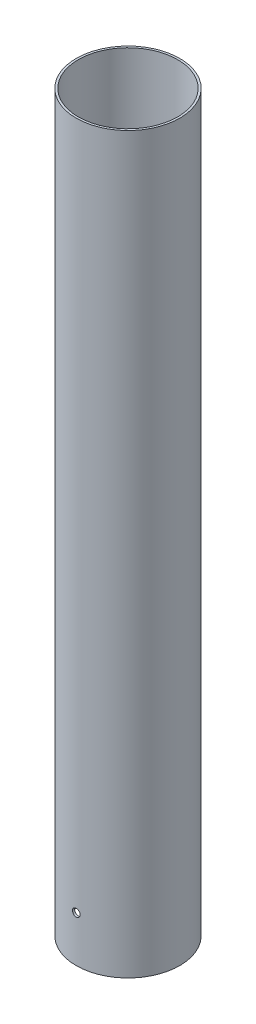
ISO-10303-21;
HEADER;
FILE_DESCRIPTION(('STEP AP214'),'2;1');
FILE_NAME('part.step','',(''),(''),'','','');
FILE_SCHEMA(('AUTOMOTIVE_DESIGN { 1 0 10303 214 1 1 1 1 }'));
ENDSEC;
DATA;
#1=APPLICATION_CONTEXT('core data for automotive mechanical design processes');
#2=APPLICATION_PROTOCOL_DEFINITION('international standard','automotive_design',2000,#1);
#3=PRODUCT_CONTEXT('',#1,'mechanical');
#4=PRODUCT('Part','Part','',(#3));
#5=PRODUCT_RELATED_PRODUCT_CATEGORY('part','',(#4));
#6=PRODUCT_DEFINITION_FORMATION('','',#4);
#7=PRODUCT_DEFINITION_CONTEXT('part definition',#1,'design');
#8=PRODUCT_DEFINITION('design','',#6,#7);
#9=PRODUCT_DEFINITION_SHAPE('','',#8);
#10=(LENGTH_UNIT() NAMED_UNIT(*) SI_UNIT(.MILLI.,.METRE.));
#11=(NAMED_UNIT(*) PLANE_ANGLE_UNIT() SI_UNIT($,.RADIAN.));
#12=(NAMED_UNIT(*) SI_UNIT($,.STERADIAN.) SOLID_ANGLE_UNIT());
#13=UNCERTAINTY_MEASURE_WITH_UNIT(LENGTH_MEASURE(1.E-05),#10,'distance_accuracy_value','');
#14=(GEOMETRIC_REPRESENTATION_CONTEXT(3) GLOBAL_UNCERTAINTY_ASSIGNED_CONTEXT((#13)) GLOBAL_UNIT_ASSIGNED_CONTEXT((#10,
#11,#12)) REPRESENTATION_CONTEXT('',''));
#15=CARTESIAN_POINT('',(0.,0.,0.));
#16=DIRECTION('',(0.,0.,1.));
#17=DIRECTION('',(1.,0.,0.));
#18=AXIS2_PLACEMENT_3D('',#15,#16,#17);
#19=CARTESIAN_POINT('',(0.,609.6,0.));
#20=DIRECTION('',(0.,1.,0.));
#21=DIRECTION('',(0.,0.,1.));
#22=AXIS2_PLACEMENT_3D('',#19,#20,#21);
#23=PLANE('',#22);
#24=CARTESIAN_POINT('',(0.,609.6,0.));
#25=DIRECTION('',(0.,1.,0.));
#26=DIRECTION('',(0.,0.,1.));
#27=AXIS2_PLACEMENT_3D('',#24,#25,#26);
#28=CIRCLE('',#27,43.);
#29=CARTESIAN_POINT('',(0.,609.6,43.));
#30=VERTEX_POINT('',#29);
#31=EDGE_CURVE('E10',#30,#30,#28,.T.);
#32=ORIENTED_EDGE('',*,*,#31,.T.);
#33=EDGE_LOOP('',(#32));
#34=FACE_BOUND('',#33,.T.);
#35=CARTESIAN_POINT('',(0.,609.6,0.));
#36=DIRECTION('',(0.,1.,0.));
#37=DIRECTION('',(0.,0.,1.));
#38=AXIS2_PLACEMENT_3D('',#35,#36,#37);
#39=CIRCLE('',#38,41.25);
#40=CARTESIAN_POINT('',(0.,609.6,41.25));
#41=VERTEX_POINT('',#40);
#42=EDGE_CURVE('E57',#41,#41,#39,.T.);
#43=ORIENTED_EDGE('',*,*,#42,.F.);
#44=EDGE_LOOP('',(#43));
#45=FACE_BOUND('',#44,.T.);
#46=ADVANCED_FACE('F40',(#34,#45),#23,.T.);
#47=CARTESIAN_POINT('',(0.,0.,0.));
#48=DIRECTION('',(0.,1.,0.));
#49=DIRECTION('',(0.,0.,1.));
#50=AXIS2_PLACEMENT_3D('',#47,#48,#49);
#51=PLANE('',#50);
#52=CARTESIAN_POINT('',(0.,0.,0.));
#53=DIRECTION('',(0.,1.,0.));
#54=DIRECTION('',(0.,0.,1.));
#55=AXIS2_PLACEMENT_3D('',#52,#53,#54);
#56=CIRCLE('',#55,43.);
#57=CARTESIAN_POINT('',(0.,0.,43.));
#58=VERTEX_POINT('',#57);
#59=EDGE_CURVE('E51',#58,#58,#56,.T.);
#60=ORIENTED_EDGE('',*,*,#59,.F.);
#61=EDGE_LOOP('',(#60));
#62=FACE_BOUND('',#61,.T.);
#63=CARTESIAN_POINT('',(0.,0.,0.));
#64=DIRECTION('',(0.,1.,0.));
#65=DIRECTION('',(0.,0.,1.));
#66=AXIS2_PLACEMENT_3D('',#63,#64,#65);
#67=CIRCLE('',#66,41.25);
#68=CARTESIAN_POINT('',(0.,0.,41.25));
#69=VERTEX_POINT('',#68);
#70=EDGE_CURVE('E56',#69,#69,#67,.T.);
#71=ORIENTED_EDGE('',*,*,#70,.T.);
#72=EDGE_LOOP('',(#71));
#73=FACE_BOUND('',#72,.T.);
#74=ADVANCED_FACE('F92',(#62,#73),#51,.F.);
#75=CARTESIAN_POINT('',(0.,609.6,0.));
#76=DIRECTION('',(0.,-1.,0.));
#77=DIRECTION('',(0.,0.,-1.));
#78=AXIS2_PLACEMENT_3D('',#75,#76,#77);
#79=CYLINDRICAL_SURFACE('',#78,43.);
#80=CARTESIAN_POINT('',(0.,41.2750000000001,-43.));
#81=CARTESIAN_POINT('',(-0.178080890278548,41.2749921925872,-42.9999984530638));
#82=CARTESIAN_POINT('',(-0.356284712003607,41.2599672013853,-42.9988819276658));
#83=CARTESIAN_POINT('',(-0.707766691666529,41.2002480288784,-42.9945352321189));
#84=CARTESIAN_POINT('',(-0.881038955698625,41.1555197827692,-42.991302635241));
#85=CARTESIAN_POINT('',(-1.21751605739711,41.0376902820454,-42.9830892896828));
#86=CARTESIAN_POINT('',(-1.38072634589228,40.9646045487394,-42.9781094974625));
#87=CARTESIAN_POINT('',(-1.69252178571755,40.7921612300685,-42.9669610179934));
#88=CARTESIAN_POINT('',(-1.84111016378582,40.6928094589692,-42.9607925939426));
#89=CARTESIAN_POINT('',(-2.11978682336371,40.4704349590726,-42.9479455835229));
#90=CARTESIAN_POINT('',(-2.24984134322119,40.347369968883,-42.9412660993587));
#91=CARTESIAN_POINT('',(-2.48746921559661,40.0811508918236,-42.9281573801845));
#92=CARTESIAN_POINT('',(-2.59504160463728,39.9379959444329,-42.921728155909));
#93=CARTESIAN_POINT('',(-2.78476194235004,39.6354613081123,-42.9098377967544));
#94=CARTESIAN_POINT('',(-2.8668808550695,39.4760633633464,-42.9043777704948));
#95=CARTESIAN_POINT('',(-3.00317760267469,39.145695027306,-42.895053543123));
#96=CARTESIAN_POINT('',(-3.05735583593308,38.9747248010661,-42.8911893192584));
#97=CARTESIAN_POINT('',(-3.13613700733552,38.6263985013542,-42.8855012577534));
#98=CARTESIAN_POINT('',(-3.16079415273694,38.4490547500252,-42.8836736808068));
#99=CARTESIAN_POINT('',(-3.18000062732119,38.0927369368438,-42.8822538289768));
#100=CARTESIAN_POINT('',(-3.17455041136404,37.9137628996626,-42.882661520323));
#101=CARTESIAN_POINT('',(-3.13374175334891,37.5596353633793,-42.8856627608789));
#102=CARTESIAN_POINT('',(-3.09844209632379,37.3844750485702,-42.8882520137184));
#103=CARTESIAN_POINT('',(-2.99902784109208,37.0425725092247,-42.8953178607517));
#104=CARTESIAN_POINT('',(-2.93491301469597,36.875830351364,-42.8997944698916));
#105=CARTESIAN_POINT('',(-2.77962213459065,36.5553092225893,-42.9101355380846));
#106=CARTESIAN_POINT('',(-2.68841956305396,36.4015431450468,-42.9160013559726));
#107=CARTESIAN_POINT('',(-2.48156125802904,36.1114800026163,-42.9284585604249));
#108=CARTESIAN_POINT('',(-2.36590513740745,35.9751832143461,-42.9350499584753));
#109=CARTESIAN_POINT('',(-2.11309240219314,35.7235857074679,-42.9482346838127));
#110=CARTESIAN_POINT('',(-1.97588494094166,35.6083360731802,-42.9548279778887));
#111=CARTESIAN_POINT('',(-1.68404214917182,35.4024988981226,-42.967258435967));
#112=CARTESIAN_POINT('',(-1.52940681002299,35.3119113695657,-42.9730955995949));
#113=CARTESIAN_POINT('',(-1.20706567203664,35.1579735918848,-42.9833568536701));
#114=CARTESIAN_POINT('',(-1.03935886587525,35.0946254443601,-42.9877808350794));
#115=CARTESIAN_POINT('',(-0.695649920978167,34.996999607294,-42.9947158983493));
#116=CARTESIAN_POINT('',(-0.519647917444296,34.9627214441193,-42.9972270113759));
#117=CARTESIAN_POINT('',(-0.164787627375498,34.9242722863006,-43.0000493884756));
#118=CARTESIAN_POINT('',(0.0140629710339285,34.9200306974933,-43.0003658106363));
#119=CARTESIAN_POINT('',(0.369932900386155,34.9415903953461,-42.9987769012005));
#120=CARTESIAN_POINT('',(0.546952244683178,34.9673914627673,-42.9968715858173));
#121=CARTESIAN_POINT('',(0.893934641233323,35.0482455935355,-42.9910568982364));
#122=CARTESIAN_POINT('',(1.06390532075827,35.1032660986625,-42.9871497567754));
#123=CARTESIAN_POINT('',(1.39220139663189,35.2409641148094,-42.9777706456797));
#124=CARTESIAN_POINT('',(1.55052664747236,35.3236419713329,-42.9722986564965));
#125=CARTESIAN_POINT('',(1.85135985062513,35.5144863066876,-42.9603910980876));
#126=CARTESIAN_POINT('',(1.99383794447536,35.6226997403129,-42.9539537618273));
#127=CARTESIAN_POINT('',(2.25863140718485,35.8614753675593,-42.94084529163));
#128=CARTESIAN_POINT('',(2.38094650065111,35.9920378663818,-42.9341741545012));
#129=CARTESIAN_POINT('',(2.60218256378532,36.272110911325,-42.9213348412408));
#130=CARTESIAN_POINT('',(2.70105759791058,36.4216577952667,-42.9151676679684));
#131=CARTESIAN_POINT('',(2.87229225765255,36.7352728023854,-42.9040479624708));
#132=CARTESIAN_POINT('',(2.9446520987531,36.8993408075386,-42.8990954203748));
#133=CARTESIAN_POINT('',(3.06072345168152,37.2371756013399,-42.8909708137378));
#134=CARTESIAN_POINT('',(3.10446347116665,37.410932551166,-42.8877969779153));
#135=CARTESIAN_POINT('',(3.16214652183753,37.7633485811067,-42.8835828597082));
#136=CARTESIAN_POINT('',(3.17608998889143,37.9420075894744,-42.8825425461141));
#137=CARTESIAN_POINT('',(3.17377954494961,38.2986996888996,-42.882713571444));
#138=CARTESIAN_POINT('',(3.15759782543107,38.4767332546271,-42.8839195274499));
#139=CARTESIAN_POINT('',(3.09564646427974,38.8275474403053,-42.8884357853101));
#140=CARTESIAN_POINT('',(3.04987677293552,39.0003280514299,-42.8917460906998));
#141=CARTESIAN_POINT('',(2.93006607131261,39.3357392648089,-42.9000966659458));
#142=CARTESIAN_POINT('',(2.85602590759719,39.4983701708278,-42.9051368839991));
#143=CARTESIAN_POINT('',(2.68178473491599,39.8089040828658,-42.9163793770205));
#144=CARTESIAN_POINT('',(2.58158426719612,39.9568073935053,-42.9225816279458));
#145=CARTESIAN_POINT('',(2.35759673077369,40.2340560767916,-42.9354668647466));
#146=CARTESIAN_POINT('',(2.2337566326123,40.3633585572988,-42.9421509100131));
#147=CARTESIAN_POINT('',(1.96609275166562,40.599389089693,-42.9552370894557));
#148=CARTESIAN_POINT('',(1.82226411498378,40.7061116424801,-42.9616391546587));
#149=CARTESIAN_POINT('',(1.51848506175089,40.8940638227667,-42.9734491093586));
#150=CARTESIAN_POINT('',(1.35850998407754,40.9752536503236,-42.9788554413436));
#151=CARTESIAN_POINT('',(1.0272712688814,41.1095188971835,-42.9880454454713));
#152=CARTESIAN_POINT('',(0.856020988799548,41.1626269335881,-42.9918309991766));
#153=CARTESIAN_POINT('',(0.569784772696316,41.225558743622,-42.9963711463035));
#154=CARTESIAN_POINT('',(0.456644461209895,41.2440749019861,-42.9977258440067));
#155=CARTESIAN_POINT('',(0.229019715307315,41.2687980285457,-42.9995407674244));
#156=CARTESIAN_POINT('',(0.114535283589739,41.2750050214499,-43.0000009949342));
#157=CARTESIAN_POINT('',(0.,41.2750000000001,-43.));
#158=B_SPLINE_CURVE_WITH_KNOTS('',3,(#80,#81,#82,#83,#84,#85,#86,#87,#88,#89,#90,#91,#92,#93,
#94,#95,#96,#97,#98,#99,#100,#101,#102,#103,#104,#105,#106,#107,#108,#109,#110,#111,#112,#113,
#114,#115,#116,#117,#118,#119,#120,#121,#122,#123,#124,#125,#126,#127,#128,#129,#130,#131,#132,
#133,#134,#135,#136,#137,#138,#139,#140,#141,#142,#143,#144,#145,#146,#147,#148,#149,#150,#151,
#152,#153,#154,#155,#156,#157),.UNSPECIFIED.,.T.,.F.,(4,2,2,2,2,2,2,2,2,2,2,2,2,2,2,2,2,2,2,2,2,
2,2,2,2,2,2,2,2,2,2,2,2,2,2,2,2,2,4),(0.,0.533824520312558,1.06826231026517,1.60240799046159,
2.13643553071395,2.67142376089227,3.20643491342423,3.74205415057173,4.27766575075546,
4.81229233356235,5.34691083928832,5.88047892103685,6.41405122822607,6.94814761296147,
7.48225245381131,8.01763689347556,8.55302159826867,9.08844760217696,9.6238648822958,
10.1580233664902,10.6921779526418,11.2257385935851,11.7593059001708,12.2938620819973,
12.828425564366,13.3640281288709,13.8996263405407,14.4346902376134,14.9697463076425,
15.5035218287095,16.0372982465875,16.571058681709,17.1048080744221,17.639769175114,
18.174860410275,18.7107816482699,19.2460790368242,19.5894166372752,19.9327535485267),.UNSPECIFIED.);
#159=CARTESIAN_POINT('',(0.,41.2750000000001,-43.));
#160=VERTEX_POINT('',#159);
#161=EDGE_CURVE('E83',#160,#160,#158,.T.);
#162=ORIENTED_EDGE('',*,*,#161,.T.);
#163=EDGE_LOOP('',(#162));
#164=FACE_BOUND('',#163,.T.);
#165=CARTESIAN_POINT('',(3.175,38.1,42.8826232289957));
#166=CARTESIAN_POINT('',(3.17499219191277,37.9219198558816,42.8826247917073));
#167=CARTESIAN_POINT('',(3.15996732236211,37.7437167778511,42.883744444033));
#168=CARTESIAN_POINT('',(3.10024867701346,37.3922363434498,42.8881023115761));
#169=CARTESIAN_POINT('',(3.05552083386315,37.2189648815677,42.8913429593739));
#170=CARTESIAN_POINT('',(2.93769251202635,36.8824894756901,42.899573773181));
#171=CARTESIAN_POINT('',(2.86460757384706,36.719280074072,42.9045629807844));
#172=CARTESIAN_POINT('',(2.69216612738504,36.4074861189637,42.9157275457184));
#173=CARTESIAN_POINT('',(2.59281543140287,36.2588983398517,42.9219026405434));
#174=CARTESIAN_POINT('',(2.3704420153182,35.980220998641,42.9347574122741));
#175=CARTESIAN_POINT('',(2.24737679384566,35.8501653891717,42.9414379818395));
#176=CARTESIAN_POINT('',(1.9811567974393,35.6125354153488,42.9545427372441));
#177=CARTESIAN_POINT('',(1.83800116494937,35.5049620111327,42.9609669121241));
#178=CARTESIAN_POINT('',(1.53546593362907,35.3152406159898,42.9728431959173));
#179=CARTESIAN_POINT('',(1.37606819673095,35.2331214734155,42.9782941989511));
#180=CARTESIAN_POINT('',(1.04570031262828,35.0968242434365,42.9876004180085));
#181=CARTESIAN_POINT('',(0.874730329314287,35.0426457604192,42.9914556566264));
#182=CARTESIAN_POINT('',(0.526404751927215,34.963864060984,42.9971297524026));
#183=CARTESIAN_POINT('',(0.349061484289852,34.9392066175597,42.9989523428957));
#184=CARTESIAN_POINT('',(-0.00725538341894811,34.9199993793653,43.0003684020365));
#185=CARTESIAN_POINT('',(-0.186228958991557,34.9254491329136,42.9999619041258));
#186=CARTESIAN_POINT('',(-0.540358546726975,34.9662570633563,42.9969686845604));
#187=CARTESIAN_POINT('',(-0.715521320250383,35.0015569205617,42.9943862142504));
#188=CARTESIAN_POINT('',(-1.05742867382875,35.1009724301849,42.9873365431041));
#189=CARTESIAN_POINT('',(-1.22417318852038,35.1650883063055,42.9828693276363));
#190=CARTESIAN_POINT('',(-1.54469715664984,35.3203813505759,42.972545609959));
#191=CARTESIAN_POINT('',(-1.69846383651916,35.4115847900855,42.9666877601299));
#192=CARTESIAN_POINT('',(-1.98852781459772,35.6184449426278,42.9542415445543));
#193=CARTESIAN_POINT('',(-2.12482483582713,35.7341020432941,42.9476531672286));
#194=CARTESIAN_POINT('',(-2.37642121877672,35.9869154680675,42.9344682797056));
#195=CARTESIAN_POINT('',(-2.49166969454164,36.1241224401768,42.9278717876212));
#196=CARTESIAN_POINT('',(-2.69750476601478,36.4159638425466,42.9154300387218));
#197=CARTESIAN_POINT('',(-2.78809134715594,36.5705982831009,42.9095847823505));
#198=CARTESIAN_POINT('',(-2.94202844537802,36.8929391895962,42.8993059409808));
#199=CARTESIAN_POINT('',(-3.00537656620527,37.0606468040933,42.8948724801915));
#200=CARTESIAN_POINT('',(-3.10300210164573,37.4043575042168,42.8879213079478));
#201=CARTESIAN_POINT('',(-3.13727999472461,37.5803604532603,42.8854035649628));
#202=CARTESIAN_POINT('',(-3.17572813560598,37.9352211641457,42.8825737244188));
#203=CARTESIAN_POINT('',(-3.17996923310023,38.114071210017,42.8822564365436));
#204=CARTESIAN_POINT('',(-3.15840874988763,38.4699399158375,42.8838497161722));
#205=CARTESIAN_POINT('',(-3.13260738839698,38.6469585891404,42.8857602674196));
#206=CARTESIAN_POINT('',(-3.05175335416618,38.9939377443614,42.8915892034546));
#207=CARTESIAN_POINT('',(-2.9967335321533,39.1639059223323,42.8955053331663));
#208=CARTESIAN_POINT('',(-2.85903772122856,39.4921972978302,42.9049022595026));
#209=CARTESIAN_POINT('',(-2.77636138280605,39.6505203481604,42.9103830759009));
#210=CARTESIAN_POINT('',(-2.58551926529099,39.9513520812881,42.9223043795093));
#211=CARTESIAN_POINT('',(-2.4773061453569,40.0938306605793,42.9287466408213));
#212=CARTESIAN_POINT('',(-2.23853086795471,40.3586252491159,42.9418588146374));
#213=CARTESIAN_POINT('',(-2.10796840759853,40.4809409850615,42.9485287302259));
#214=CARTESIAN_POINT('',(-1.8278950761626,40.7021783948114,42.9613599821049));
#215=CARTESIAN_POINT('',(-1.67834786162279,40.8010541268059,42.9675203044769));
#216=CARTESIAN_POINT('',(-1.36473201118176,40.9722900118369,42.9786236747559));
#217=CARTESIAN_POINT('',(-1.20066349336302,41.0446503804631,42.9835667325599));
#218=CARTESIAN_POINT('',(-0.86282905705276,41.160722091538,42.9916738810663));
#219=CARTESIAN_POINT('',(-0.689073056091315,41.2044621700263,42.9948397556839));
#220=CARTESIAN_POINT('',(-0.3366590239496,41.2621456603718,42.9990430133932));
#221=CARTESIAN_POINT('',(-0.158001063685077,41.2760895030556,43.0000804272605));
#222=CARTESIAN_POINT('',(0.198691713833563,41.2737801371871,42.9999099473969));
#223=CARTESIAN_POINT('',(0.376727002540882,41.2575986704487,42.9987073880391));
#224=CARTESIAN_POINT('',(0.727544696254575,41.1956472079124,42.9942026919008));
#225=CARTESIAN_POINT('',(0.900327092980339,41.1498771654739,42.9909005518109));
#226=CARTESIAN_POINT('',(1.23574182244036,41.0300651075378,42.9825675042535));
#227=CARTESIAN_POINT('',(1.3983744563657,40.956023931442,42.9775366481141));
#228=CARTESIAN_POINT('',(1.70891140049139,40.7817802005019,42.9663099880376));
#229=CARTESIAN_POINT('',(1.85681601637793,40.6815781887931,42.9601142082866));
#230=CARTESIAN_POINT('',(2.13406457638854,40.4575889739359,42.9472363058321));
#231=CARTESIAN_POINT('',(2.26336591188994,40.3337490930527,42.9405531178782));
#232=CARTESIAN_POINT('',(2.49939423582194,40.066086115014,42.9274625561682));
#233=CARTESIAN_POINT('',(2.60611572218217,39.922258161444,42.9210552499389));
#234=CARTESIAN_POINT('',(2.79406677735234,39.6184796447893,42.9092309495466));
#235=CARTESIAN_POINT('',(2.87525634866138,39.4585042984237,42.903815514705));
#236=CARTESIAN_POINT('',(3.0095210416056,39.1272650093471,42.8946075199265));
#237=CARTESIAN_POINT('',(3.06262878412664,38.9560144256798,42.8908130779737));
#238=CARTESIAN_POINT('',(3.12555975121955,38.6697789983539,42.8862617061244));
#239=CARTESIAN_POINT('',(3.14407553050264,38.5566398388549,42.8849034629797));
#240=CARTESIAN_POINT('',(3.16879815334902,38.3290174018517,42.8830837227866));
#241=CARTESIAN_POINT('',(3.17500502185383,38.2145341270715,42.8826222239212));
#242=CARTESIAN_POINT('',(3.175,38.1,42.8826232289957));
#243=B_SPLINE_CURVE_WITH_KNOTS('',3,(#165,#166,#167,#168,#169,#170,#171,#172,#173,#174,#175,
#176,#177,#178,#179,#180,#181,#182,#183,#184,#185,#186,#187,#188,#189,#190,#191,#192,#193,#194,
#195,#196,#197,#198,#199,#200,#201,#202,#203,#204,#205,#206,#207,#208,#209,#210,#211,#212,#213,
#214,#215,#216,#217,#218,#219,#220,#221,#222,#223,#224,#225,#226,#227,#228,#229,#230,#231,#232,
#233,#234,#235,#236,#237,#238,#239,#240,#241,#242),.UNSPECIFIED.,.T.,.F.,(4,2,2,2,2,2,2,2,2,2,2,
2,2,2,2,2,2,2,2,2,2,2,2,2,2,2,2,2,2,2,2,2,2,2,2,2,2,2,4),(0.,0.53382227925262,1.06825787733989,
1.60240100202611,2.13642602596875,2.67141718826495,3.20643119352619,3.74204935348131,
4.27765992939466,4.81228512876009,5.34690230746007,5.88047738383933,6.41405660250958,
6.94815502194702,7.48226190841883,8.01764341080625,8.55302522942709,9.08845413765158,
9.62387423310297,10.1580309773761,10.6921838239963,11.2257373825583,11.7592976841857,
12.2938549955515,12.8284195520467,13.3640233357507,13.8996227645003,14.4346835991259,
14.9697366972015,15.5035172245507,16.0372985933029,16.5710641147186,17.1048185552969,
17.6397766734643,18.1748649960428,18.7107874429298,19.2460859672772,19.5894201046012,
19.9327535462277),.UNSPECIFIED.);
#244=CARTESIAN_POINT('',(3.175,38.1,42.8826232289957));
#245=VERTEX_POINT('',#244);
#246=EDGE_CURVE('E78',#245,#245,#243,.T.);
#247=ORIENTED_EDGE('',*,*,#246,.T.);
#248=EDGE_LOOP('',(#247));
#249=FACE_BOUND('',#248,.T.);
#250=ORIENTED_EDGE('',*,*,#31,.F.);
#251=EDGE_LOOP('',(#250));
#252=FACE_BOUND('',#251,.T.);
#253=ORIENTED_EDGE('',*,*,#59,.T.);
#254=EDGE_LOOP('',(#253));
#255=FACE_BOUND('',#254,.T.);
#256=ADVANCED_FACE('F39',(#164,#249,#252,#255),#79,.T.);
#257=CARTESIAN_POINT('',(0.,609.6,0.));
#258=DIRECTION('',(0.,-1.,0.));
#259=DIRECTION('',(0.,0.,-1.));
#260=AXIS2_PLACEMENT_3D('',#257,#258,#259);
#261=CYLINDRICAL_SURFACE('',#260,41.25);
#262=CARTESIAN_POINT('',(0.,41.2750000000001,-41.25));
#263=CARTESIAN_POINT('',(-0.178058391561219,41.2749922026161,-41.2499983911121));
#264=CARTESIAN_POINT('',(-0.356239160757433,41.2599709917749,-41.2488347948735));
#265=CARTESIAN_POINT('',(-0.707674129470919,41.200267712053,-41.244304851499));
#266=CARTESIAN_POINT('',(-0.88092245980769,41.1555517308471,-41.2409359859416));
#267=CARTESIAN_POINT('',(-1.21735158371738,41.0377567096137,-41.2323763401781));
#268=CARTESIAN_POINT('',(-1.38053788687336,40.9646933542693,-41.2271865676367));
#269=CARTESIAN_POINT('',(-1.692290065253,40.7923047900148,-41.2155676825818));
#270=CARTESIAN_POINT('',(-1.84085913205737,40.6929853314972,-41.2091388415222));
#271=CARTESIAN_POINT('',(-2.11952608506285,40.4706674610311,-41.1957478408797));
#272=CARTESIAN_POINT('',(-2.24958748378838,40.3476233704826,-41.1887846683397));
#273=CARTESIAN_POINT('',(-2.48723433520254,40.0814449731661,-41.1751183419878));
#274=CARTESIAN_POINT('',(-2.59481881709312,39.9383097990926,-41.1684151994169));
#275=CARTESIAN_POINT('',(-2.78457863578543,39.6357949844291,-41.1560166731674));
#276=CARTESIAN_POINT('',(-2.86672235128294,39.4763954526305,-41.1503225473635));
#277=CARTESIAN_POINT('',(-3.00306681437132,39.1460155675728,-41.1405978217053));
#278=CARTESIAN_POINT('',(-3.05726799041541,38.9750353919294,-41.1365671963441));
#279=CARTESIAN_POINT('',(-3.13608411035867,38.6267099071718,-41.1306339818626));
#280=CARTESIAN_POINT('',(-3.16075794546302,38.4493779967762,-41.1287271574272));
#281=CARTESIAN_POINT('',(-3.18000087402132,38.0930801658672,-41.1272439185375));
#282=CARTESIAN_POINT('',(-3.1745704571354,37.9141142719785,-41.1276674661786));
#283=CARTESIAN_POINT('',(-3.13380775926326,37.5600314587829,-41.1307932799584));
#284=CARTESIAN_POINT('',(-3.0985393861792,37.384907133284,-41.1334906758507));
#285=CARTESIAN_POINT('',(-2.99920115021092,37.0430713231455,-41.1408525934625));
#286=CARTESIAN_POINT('',(-2.93513104236001,36.8763599100734,-41.145517131913));
#287=CARTESIAN_POINT('',(-2.77993616150549,36.5558780170141,-41.1562933390448));
#288=CARTESIAN_POINT('',(-2.68878260918635,36.4021215273581,-41.162406545699));
#289=CARTESIAN_POINT('',(-2.48202913166567,36.1120670367831,-41.1753897933377));
#290=CARTESIAN_POINT('',(-2.3664287852043,35.9757693367738,-41.1822598473629));
#291=CARTESIAN_POINT('',(-2.11370424520966,35.7241297486701,-41.1960043243141));
#292=CARTESIAN_POINT('',(-1.97652478303283,35.6088433582868,-41.2028787120255));
#293=CARTESIAN_POINT('',(-1.68472916036172,35.4029276990028,-41.2158401543637));
#294=CARTESIAN_POINT('',(-1.53011299033779,35.3122984435779,-41.2219272085602));
#295=CARTESIAN_POINT('',(-1.20779766852968,35.1582735549403,-41.232629034373));
#296=CARTESIAN_POINT('',(-1.04009739478863,35.0948802602402,-41.2372436795577));
#297=CARTESIAN_POINT('',(-0.696390301705412,34.9971650509977,-41.2444792079072));
#298=CARTESIAN_POINT('',(-0.520383629480138,34.9628426217771,-41.2471001263694));
#299=CARTESIAN_POINT('',(-0.165541121660285,34.9243127387591,-41.2500483545146));
#300=CARTESIAN_POINT('',(0.0132863411942503,34.9200286033876,-41.2503815043545));
#301=CARTESIAN_POINT('',(0.369117075412324,34.9414962150744,-41.2487322340797));
#302=CARTESIAN_POINT('',(0.546120361247249,34.9672477236714,-41.2467498323489));
#303=CARTESIAN_POINT('',(0.893060508725312,35.04799209765,-41.2406962332394));
#304=CARTESIAN_POINT('',(1.06300566208316,35.1029495411153,-41.2366275663611));
#305=CARTESIAN_POINT('',(1.39126196638443,35.2405096361903,-41.2268587194827));
#306=CARTESIAN_POINT('',(1.54957295966379,35.3231126623637,-41.2211585173774));
#307=CARTESIAN_POINT('',(1.85041678009382,35.5138126693397,-41.208751527443));
#308=CARTESIAN_POINT('',(1.99291723380504,35.6219605895153,-41.2020427382233));
#309=CARTESIAN_POINT('',(2.25776842168026,35.8606066914862,-41.1883794689651));
#310=CARTESIAN_POINT('',(2.38011885699114,35.9911052047135,-41.1814249852844));
#311=CARTESIAN_POINT('',(2.60145886730544,36.2710802345124,-41.1680369655298));
#312=CARTESIAN_POINT('',(2.70039850036628,36.420596295334,-41.1616045620563));
#313=CARTESIAN_POINT('',(2.87176622138098,36.7341647462706,-41.1500044633415));
#314=CARTESIAN_POINT('',(2.94419454047481,36.8982170096356,-41.1448367570742));
#315=CARTESIAN_POINT('',(3.0603981087374,37.2360223180623,-41.1363571274868));
#316=CARTESIAN_POINT('',(3.10420421819952,37.4097646951203,-41.1330432059839));
#317=CARTESIAN_POINT('',(3.16202045488889,37.7621650998761,-41.1286394196539));
#318=CARTESIAN_POINT('',(3.17603106101294,37.9408230485202,-41.1275495190806));
#319=CARTESIAN_POINT('',(3.17385339213525,38.2974867887263,-41.1277175915411));
#320=CARTESIAN_POINT('',(3.15774359860667,38.4754930676252,-41.1289694628769));
#321=CARTESIAN_POINT('',(3.09594576832383,38.8262643021898,-41.1336670700439));
#322=CARTESIAN_POINT('',(3.05025768323839,38.9990292492908,-41.1371128094599));
#323=CARTESIAN_POINT('',(2.9306193984822,39.3344208516788,-41.14580831841));
#324=CARTESIAN_POINT('',(2.85667028195127,39.497047895236,-41.1510580188042));
#325=CARTESIAN_POINT('',(2.68261832361266,39.8075908509413,-41.162769992027));
#326=CARTESIAN_POINT('',(2.58251598145473,39.9555070440613,-41.1692322416895));
#327=CARTESIAN_POINT('',(2.35870494955148,40.2328304430861,-41.1826610918161));
#328=CARTESIAN_POINT('',(2.23493843544696,40.3621909233124,-41.189628901205));
#329=CARTESIAN_POINT('',(1.96741132843237,40.5983506909985,-41.2032728345875));
#330=CARTESIAN_POINT('',(1.82364588738108,40.7051444919814,-41.2099488873361));
#331=CARTESIAN_POINT('',(1.51996344591518,40.8932605276231,-41.2222673672106));
#332=CARTESIAN_POINT('',(1.36002020907637,40.9745404800972,-41.2279080721767));
#333=CARTESIAN_POINT('',(1.02882486127576,41.1089890177637,-41.2374993390489));
#334=CARTESIAN_POINT('',(0.857586091731469,41.1621901216672,-41.2414518550657));
#335=CARTESIAN_POINT('',(0.571103564615714,41.2253278265412,-41.2461996184043));
#336=CARTESIAN_POINT('',(0.45770553619071,41.2439303605398,-41.2476183256553));
#337=CARTESIAN_POINT('',(0.229555294063546,41.2687689472998,-41.2495190340842));
#338=CARTESIAN_POINT('',(0.114803083351373,41.2750050273606,-41.2500010373299));
#339=CARTESIAN_POINT('',(0.,41.2750000000001,-41.25));
#340=B_SPLINE_CURVE_WITH_KNOTS('',3,(#262,#263,#264,#265,#266,#267,#268,#269,#270,#271,#272,
#273,#274,#275,#276,#277,#278,#279,#280,#281,#282,#283,#284,#285,#286,#287,#288,#289,#290,#291,
#292,#293,#294,#295,#296,#297,#298,#299,#300,#301,#302,#303,#304,#305,#306,#307,#308,#309,#310,
#311,#312,#313,#314,#315,#316,#317,#318,#319,#320,#321,#322,#323,#324,#325,#326,#327,#328,#329,
#330,#331,#332,#333,#334,#335,#336,#337,#338,#339),.UNSPECIFIED.,.T.,.F.,(4,2,2,2,2,2,2,2,2,2,2,
2,2,2,2,2,2,2,2,2,2,2,2,2,2,2,2,2,2,2,2,2,2,2,2,2,2,2,4),(0.,0.533756037490767,1.06812269120819,
1.60219409900978,2.13614863571186,2.67114168564388,3.20615783762756,3.74183633739633,
4.27750662316529,4.81210674394487,5.34669816922215,5.88014747954848,6.4136013270942,
6.94762407125993,7.48165601829487,8.01707869709726,8.55250166852408,9.08797060283216,
9.6234300568598,10.1575220939316,10.6916098907293,11.2250514017117,11.7585001404654,
12.2930217524782,12.8275512914843,13.3632110565144,13.8988661512619,14.433942748691,
14.9690107458827,15.5026865167142,16.0363631595786,16.5700193506607,17.1036653471424,
17.6386323908218,18.1737293479861,18.7097084557861,19.2450654651227,19.5892052363302,
19.9333442478312),.UNSPECIFIED.);
#341=CARTESIAN_POINT('',(0.,41.2750000000001,-41.25));
#342=VERTEX_POINT('',#341);
#343=EDGE_CURVE('E45',#342,#342,#340,.T.);
#344=ORIENTED_EDGE('',*,*,#343,.F.);
#345=EDGE_LOOP('',(#344));
#346=FACE_BOUND('',#345,.T.);
#347=CARTESIAN_POINT('',(3.175,38.1,41.1276290952931));
#348=CARTESIAN_POINT('',(3.17499220182063,37.921942489387,41.1276307220138));
#349=CARTESIAN_POINT('',(3.15997113458858,37.7437625982428,41.1287978596719));
#350=CARTESIAN_POINT('',(3.10026847717262,37.3923294539535,41.1333404557801));
#351=CARTESIAN_POINT('',(3.05555297165136,37.2190820706773,41.1367184392718));
#352=CARTESIAN_POINT('',(2.93775934205512,36.8826549489872,41.1452978676479));
#353=CARTESIAN_POINT('',(2.86469692532187,36.7194696929695,41.1504983025375));
#354=CARTESIAN_POINT('',(2.6923105711601,36.4077192677722,41.1621354039836));
#355=CARTESIAN_POINT('',(2.59299238180628,36.2591509083286,41.1685717998717));
#356=CARTESIAN_POINT('',(2.37067579106163,35.9804831510257,41.1819715995096));
#357=CARTESIAN_POINT('',(2.24763142775048,35.8504204660161,41.1889360099659));
#358=CARTESIAN_POINT('',(1.98145194558451,35.6127711336472,41.2025978624346));
#359=CARTESIAN_POINT('',(1.83831596292511,35.5051854531433,41.2092952929528));
#360=CARTESIAN_POINT('',(1.53580044531943,35.3154243854006,41.2216778810434));
#361=CARTESIAN_POINT('',(1.37640115816654,35.2332803981203,41.2273617840874));
#362=CARTESIAN_POINT('',(1.04602180499103,35.0969353649932,41.2370661045166));
#363=CARTESIAN_POINT('',(0.875041915232526,35.0427338939516,41.2410865472141));
#364=CARTESIAN_POINT('',(0.52671728328226,34.9639171511479,41.2470039345917));
#365=CARTESIAN_POINT('',(0.349385944927216,34.9392429645759,41.2489051072596));
#366=CARTESIAN_POINT('',(-0.00691076760115815,34.919999134909,41.2503840457583));
#367=CARTESIAN_POINT('',(-0.185876115353602,34.9254290059082,41.2499618490903));
#368=CARTESIAN_POINT('',(-0.539961348788362,34.9661908442802,41.2468451198582));
#369=CARTESIAN_POINT('',(-0.715088576492907,35.0014594531186,41.2441554021121));
#370=CARTESIAN_POINT('',(-1.05693006948914,35.1007991684443,41.2368117959173));
#371=CARTESIAN_POINT('',(-1.22364426476014,35.1648705146094,41.232157891124));
#372=CARTESIAN_POINT('',(-1.54412951188978,35.3200679496321,41.221401331101));
#373=CARTESIAN_POINT('',(-1.69788671461849,35.4112225272553,41.2152971516934));
#374=CARTESIAN_POINT('',(-1.98794219556086,35.6179781878249,41.2023263596697));
#375=CARTESIAN_POINT('',(-2.12424017244232,35.7335796926143,41.1954597338982));
#376=CARTESIAN_POINT('',(-2.375878434345,35.986305048322,41.1817150952151));
#377=CARTESIAN_POINT('',(-2.49116345604432,36.1234839329035,41.1748370989496));
#378=CARTESIAN_POINT('',(-2.6970766299054,36.4152779144294,41.161862888608));
#379=CARTESIAN_POINT('',(-2.78770476580472,36.5698930228738,41.1557666750477));
#380=CARTESIAN_POINT('',(-2.94172885129573,36.8922080696794,41.1450449274713));
#381=CARTESIAN_POINT('',(-3.00512211445513,37.0599092969209,41.1404195385483));
#382=CARTESIAN_POINT('',(-3.10283696787262,37.4036184606701,41.1331657479651));
#383=CARTESIAN_POINT('',(-3.13715907851825,37.5796262484269,41.1305373105586));
#384=CARTESIAN_POINT('',(-3.17568776182651,37.9344692551427,41.1275806154748));
#385=CARTESIAN_POINT('',(-3.17997131720254,38.1132960684589,41.1272464780189));
#386=CARTESIAN_POINT('',(-3.15850277741541,38.4691253638163,41.1289006856218));
#387=CARTESIAN_POINT('',(-3.13275092069149,38.6461278603288,41.1308890122435));
#388=CARTESIAN_POINT('',(-3.05200665801926,38.9930641830448,41.1369587397147));
#389=CARTESIAN_POINT('',(-2.99705001977698,39.163006382237,41.1410375800515));
#390=CARTESIAN_POINT('',(-2.85949252579126,39.4912571349876,41.1508265952842));
#391=CARTESIAN_POINT('',(-2.77689129075795,39.6495655288914,41.1565367925624));
#392=CARTESIAN_POINT('',(-2.58619390265872,39.950407609034,41.1689593620644));
#393=CARTESIAN_POINT('',(-2.47804635478353,40.0929086329563,41.1756737444141));
#394=CARTESIAN_POINT('',(-2.23940067074834,40.3577611450112,41.1893412412228));
#395=CARTESIAN_POINT('',(-2.10890220587957,40.4801123367537,41.1962943591916));
#396=CARTESIAN_POINT('',(-1.82892683951806,40.7014539377721,41.2096732787033));
#397=CARTESIAN_POINT('',(-1.6794103864444,40.8003943969543,41.2160979339917));
#398=CARTESIAN_POINT('',(-1.36584093488489,40.9717635683188,41.2276795413354));
#399=CARTESIAN_POINT('',(-1.20178806322592,41.0441925117795,41.2328365044495));
#400=CARTESIAN_POINT('',(-0.863983174395101,41.1603965026882,41.2412963450651));
#401=CARTESIAN_POINT('',(-0.690241918536457,41.2042026807733,41.2446012363546));
#402=CARTESIAN_POINT('',(-0.33784387486327,41.2620194347798,41.2489926943457));
#403=CARTESIAN_POINT('',(-0.159187165116975,41.2760304836372,41.250079296258));
#404=CARTESIAN_POINT('',(0.197477370035969,41.2738540877003,41.2499118192658));
#405=CARTESIAN_POINT('',(0.375485679152799,41.257744593906,41.2486637823279));
#406=CARTESIAN_POINT('',(0.726261047904129,41.1959466480263,41.2439792481316));
#407=CARTESIAN_POINT('',(0.89902809961468,41.1502581512246,41.2405427475648));
#408=CARTESIAN_POINT('',(1.23442385434102,41.0306182695134,41.2318670799545));
#409=CARTESIAN_POINT('',(1.39705294217402,40.9566679581276,41.2266279813833));
#410=CARTESIAN_POINT('',(1.70759948649671,40.7826129787039,41.2149339477293));
#411=CARTESIAN_POINT('',(1.8555172252201,40.6825088125551,41.2084790359784));
#412=CARTESIAN_POINT('',(2.13284048462109,40.4586957952282,41.1950585280864));
#413=CARTESIAN_POINT('',(2.26219961428562,40.3349295353911,41.1880917158242));
#414=CARTESIAN_POINT('',(2.49835677606692,40.0674034897082,41.174442866819));
#415=CARTESIAN_POINT('',(2.60514931819902,39.9236388527444,41.1677608996879));
#416=CARTESIAN_POINT('',(2.79326402277726,39.6199570454708,41.1554261955809));
#417=CARTESIAN_POINT('',(2.87454367062312,39.4600134948415,41.1497751830766));
#418=CARTESIAN_POINT('',(3.00899155141473,39.1288174772923,41.1401635303151));
#419=CARTESIAN_POINT('',(3.06219230752956,38.9575783536807,41.1362009354309));
#420=CARTESIAN_POINT('',(3.12532901677498,38.6710967597262,41.1314404242538));
#421=CARTESIAN_POINT('',(3.14393110296708,38.5577000889599,41.1300176841243));
#422=CARTESIAN_POINT('',(3.16876909470889,38.3295525678281,41.1281114962812));
#423=CARTESIAN_POINT('',(3.17500502783851,38.2148017204834,41.1276280464728));
#424=CARTESIAN_POINT('',(3.175,38.1,41.1276290952931));
#425=B_SPLINE_CURVE_WITH_KNOTS('',3,(#347,#348,#349,#350,#351,#352,#353,#354,#355,#356,#357,
#358,#359,#360,#361,#362,#363,#364,#365,#366,#367,#368,#369,#370,#371,#372,#373,#374,#375,#376,
#377,#378,#379,#380,#381,#382,#383,#384,#385,#386,#387,#388,#389,#390,#391,#392,#393,#394,#395,
#396,#397,#398,#399,#400,#401,#402,#403,#404,#405,#406,#407,#408,#409,#410,#411,#412,#413,#414,
#415,#416,#417,#418,#419,#420,#421,#422,#423,#424),.UNSPECIFIED.,.T.,.F.,(4,2,2,2,2,2,2,2,2,2,2,
2,2,2,2,2,2,2,2,2,2,2,2,2,2,2,2,2,2,2,2,2,2,2,2,2,2,2,4),(0.,0.533753391571683,1.06811745751655,
1.60218584824494,2.13613741413489,2.67113392596793,3.20615344610399,3.74183067623322,
4.27749975484685,4.81209823914218,5.34668809457695,5.88014566125058,6.41360766709721,
6.94763281869125,7.48166718588856,8.01708639311665,8.55250595347948,9.08797831520288,
9.62344109151251,10.1575310823595,10.6916168333066,11.2250499806758,11.7584904471641,
12.293013384718,12.8275441840282,13.3632053981006,13.8988619391134,14.433934916322,
14.9689994002915,15.5026810708104,16.0363635481311,16.5700257555616,17.1036777228348,
17.6386412484579,18.1737347702044,18.7097152934665,19.2450736321204,19.5892093224234,
19.9333442452093),.UNSPECIFIED.);
#426=CARTESIAN_POINT('',(3.175,38.1,41.1276290952931));
#427=VERTEX_POINT('',#426);
#428=EDGE_CURVE('E64',#427,#427,#425,.T.);
#429=ORIENTED_EDGE('',*,*,#428,.F.);
#430=EDGE_LOOP('',(#429));
#431=FACE_BOUND('',#430,.T.);
#432=ORIENTED_EDGE('',*,*,#42,.T.);
#433=EDGE_LOOP('',(#432));
#434=FACE_BOUND('',#433,.T.);
#435=ORIENTED_EDGE('',*,*,#70,.F.);
#436=EDGE_LOOP('',(#435));
#437=FACE_BOUND('',#436,.T.);
#438=ADVANCED_FACE('F69',(#346,#431,#434,#437),#261,.F.);
#439=CARTESIAN_POINT('',(0.,38.1,-43.));
#440=DIRECTION('',(0.,0.,1.));
#441=DIRECTION('',(1.,0.,0.));
#442=AXIS2_PLACEMENT_3D('',#439,#440,#441);
#443=CYLINDRICAL_SURFACE('',#442,3.175);
#444=ORIENTED_EDGE('',*,*,#428,.T.);
#445=EDGE_LOOP('',(#444));
#446=FACE_BOUND('',#445,.T.);
#447=ORIENTED_EDGE('',*,*,#246,.F.);
#448=EDGE_LOOP('',(#447));
#449=FACE_BOUND('',#448,.T.);
#450=ADVANCED_FACE('F75',(#446,#449),#443,.F.);
#451=ORIENTED_EDGE('',*,*,#343,.T.);
#452=EDGE_LOOP('',(#451));
#453=FACE_BOUND('',#452,.T.);
#454=ORIENTED_EDGE('',*,*,#161,.F.);
#455=EDGE_LOOP('',(#454));
#456=FACE_BOUND('',#455,.T.);
#457=ADVANCED_FACE('F68',(#453,#456),#443,.F.);
#458=CLOSED_SHELL('',(#46,#74,#256,#438,#450,#457));
#459=MANIFOLD_SOLID_BREP('B2',#458);
#460=ADVANCED_BREP_SHAPE_REPRESENTATION('',(#18,#459),#14);
#461=SHAPE_DEFINITION_REPRESENTATION(#9,#460);
ENDSEC;
END-ISO-10303-21;
